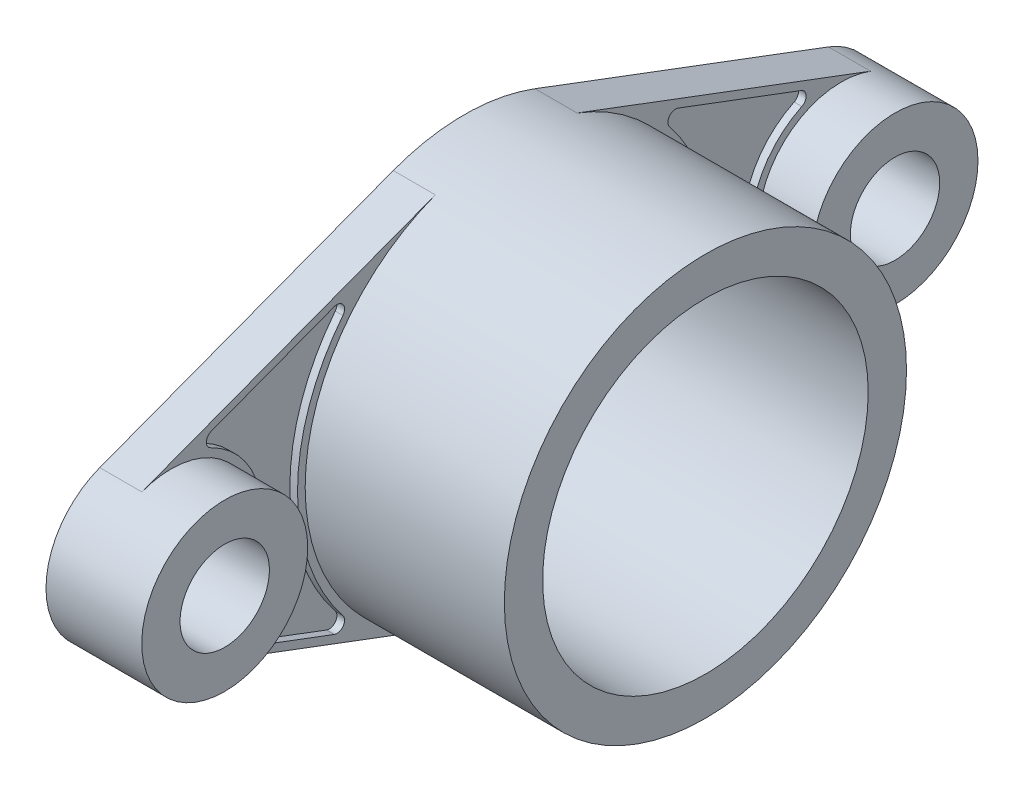
ISO-10303-21;
HEADER;
FILE_DESCRIPTION(('STEP AP214'),'2;1');
FILE_NAME('part.step','',(''),(''),'','','');
FILE_SCHEMA(('AUTOMOTIVE_DESIGN { 1 0 10303 214 1 1 1 1 }'));
ENDSEC;
DATA;
#1=APPLICATION_CONTEXT('core data for automotive mechanical design processes');
#2=APPLICATION_PROTOCOL_DEFINITION('international standard','automotive_design',2000,#1);
#3=PRODUCT_CONTEXT('',#1,'mechanical');
#4=PRODUCT('Part','Part','',(#3));
#5=PRODUCT_RELATED_PRODUCT_CATEGORY('part','',(#4));
#6=PRODUCT_DEFINITION_FORMATION('','',#4);
#7=PRODUCT_DEFINITION_CONTEXT('part definition',#1,'design');
#8=PRODUCT_DEFINITION('design','',#6,#7);
#9=PRODUCT_DEFINITION_SHAPE('','',#8);
#10=(LENGTH_UNIT() NAMED_UNIT(*) SI_UNIT(.MILLI.,.METRE.));
#11=(NAMED_UNIT(*) PLANE_ANGLE_UNIT() SI_UNIT($,.RADIAN.));
#12=(NAMED_UNIT(*) SI_UNIT($,.STERADIAN.) SOLID_ANGLE_UNIT());
#13=UNCERTAINTY_MEASURE_WITH_UNIT(LENGTH_MEASURE(1.E-05),#10,'distance_accuracy_value','');
#14=(GEOMETRIC_REPRESENTATION_CONTEXT(3) GLOBAL_UNCERTAINTY_ASSIGNED_CONTEXT((#13)) GLOBAL_UNIT_ASSIGNED_CONTEXT((#10,
#11,#12)) REPRESENTATION_CONTEXT('',''));
#15=CARTESIAN_POINT('',(0.,0.,0.));
#16=DIRECTION('',(0.,0.,1.));
#17=DIRECTION('',(1.,0.,0.));
#18=AXIS2_PLACEMENT_3D('',#15,#16,#17);
#19=CARTESIAN_POINT('',(11.,0.,87.5));
#20=DIRECTION('',(1.,0.,0.));
#21=DIRECTION('',(0.,0.,-1.));
#22=AXIS2_PLACEMENT_3D('',#19,#20,#21);
#23=PLANE('',#22);
#24=CARTESIAN_POINT('',(11.,0.,87.5));
#25=DIRECTION('',(-1.,0.,0.));
#26=DIRECTION('',(0.,0.,-1.));
#27=AXIS2_PLACEMENT_3D('',#24,#25,#26);
#28=CIRCLE('',#27,21.6666666666667);
#29=CARTESIAN_POINT('',(11.,20.2768940260314,95.1349206349206));
#30=VERTEX_POINT('',#29);
#31=CARTESIAN_POINT('',(11.,-20.2768940260314,95.1349206349206));
#32=VERTEX_POINT('',#31);
#33=EDGE_CURVE('E387',#30,#32,#28,.T.);
#34=ORIENTED_EDGE('',*,*,#33,.T.);
#35=DIRECTION('',(0.,-0.352380952380952,-0.935856647355295));
#36=VECTOR('',#35,1.);
#37=CARTESIAN_POINT('',(11.,-20.2768940260314,95.1349206349206));
#38=LINE('',#37,#36);
#39=CARTESIAN_POINT('',(11.,-49.132473986153,18.5));
#40=VERTEX_POINT('',#39);
#41=EDGE_CURVE('E390',#32,#40,#38,.T.);
#42=ORIENTED_EDGE('',*,*,#41,.T.);
#43=CARTESIAN_POINT('',(11.,0.,0.));
#44=DIRECTION('',(-1.,0.,0.));
#45=DIRECTION('',(0.,0.,-1.));
#46=AXIS2_PLACEMENT_3D('',#43,#44,#45);
#47=CIRCLE('',#46,52.5);
#48=CARTESIAN_POINT('',(11.,49.132473986153,18.5));
#49=VERTEX_POINT('',#48);
#50=EDGE_CURVE('E394',#40,#49,#47,.T.);
#51=ORIENTED_EDGE('',*,*,#50,.T.);
#52=DIRECTION('',(0.,-0.352380952380952,0.935856647355295));
#53=VECTOR('',#52,1.);
#54=CARTESIAN_POINT('',(11.,20.2768940260314,95.1349206349206));
#55=LINE('',#54,#53);
#56=EDGE_CURVE('E397',#49,#30,#55,.T.);
#57=ORIENTED_EDGE('',*,*,#56,.T.);
#58=EDGE_LOOP('',(#34,#42,#51,#57));
#59=FACE_BOUND('',#58,.T.);
#60=CARTESIAN_POINT('',(11.,23.0944437111429,76.300694331762));
#61=DIRECTION('',(1.,0.,0.));
#62=DIRECTION('',(0.,0.,1.));
#63=AXIS2_PLACEMENT_3D('',#60,#61,#62);
#64=CIRCLE('',#63,1.99999999999999);
#65=CARTESIAN_POINT('',(11.,24.9661570058535,77.0054562365239));
#66=VERTEX_POINT('',#65);
#67=CARTESIAN_POINT('',(11.,21.2948766687162,77.1733675007156));
#68=VERTEX_POINT('',#67);
#69=EDGE_CURVE('E56',#66,#68,#64,.T.);
#70=ORIENTED_EDGE('',*,*,#69,.F.);
#71=DIRECTION('',(0.,-0.352380952380952,0.935856647355295));
#72=VECTOR('',#71,1.);
#73=CARTESIAN_POINT('',(11.,37.0477904131755,44.9189406097408));
#74=LINE('',#73,#72);
#75=CARTESIAN_POINT('',(11.,37.0477904131755,44.9189406097408));
#76=VERTEX_POINT('',#75);
#77=EDGE_CURVE('E223',#76,#66,#74,.T.);
#78=ORIENTED_EDGE('',*,*,#77,.F.);
#79=CARTESIAN_POINT('',(11.,35.1760771184649,44.2141787049789));
#80=DIRECTION('',(1.,0.,0.));
#81=DIRECTION('',(0.,0.,-1.));
#82=AXIS2_PLACEMENT_3D('',#79,#80,#81);
#83=CIRCLE('',#82,2.00000000000001);
#84=CARTESIAN_POINT('',(11.,33.9309062470148,42.6490750340062));
#85=VERTEX_POINT('',#84);
#86=EDGE_CURVE('E226',#85,#76,#83,.T.);
#87=ORIENTED_EDGE('',*,*,#86,.F.);
#88=CARTESIAN_POINT('',(11.,0.,0.));
#89=DIRECTION('',(-1.,0.,0.));
#90=DIRECTION('',(0.,0.,-1.));
#91=AXIS2_PLACEMENT_3D('',#88,#89,#90);
#92=CIRCLE('',#91,54.5);
#93=CARTESIAN_POINT('',(11.,-33.9309062470148,42.6490750340062));
#94=VERTEX_POINT('',#93);
#95=EDGE_CURVE('E255',#94,#85,#92,.T.);
#96=ORIENTED_EDGE('',*,*,#95,.F.);
#97=CARTESIAN_POINT('',(11.,-35.1760771184649,44.2141787049789));
#98=DIRECTION('',(1.,0.,0.));
#99=DIRECTION('',(0.,0.,-1.));
#100=AXIS2_PLACEMENT_3D('',#97,#98,#99);
#101=CIRCLE('',#100,2.);
#102=CARTESIAN_POINT('',(11.,-37.0477904131755,44.9189406097408));
#103=VERTEX_POINT('',#102);
#104=EDGE_CURVE('E252',#103,#94,#101,.T.);
#105=ORIENTED_EDGE('',*,*,#104,.F.);
#106=DIRECTION('',(0.,-0.352380952380952,-0.935856647355295));
#107=VECTOR('',#106,1.);
#108=CARTESIAN_POINT('',(11.,-24.9661570058535,77.0054562365239));
#109=LINE('',#108,#107);
#110=CARTESIAN_POINT('',(11.,-24.9661570058535,77.0054562365239));
#111=VERTEX_POINT('',#110);
#112=EDGE_CURVE('E249',#111,#103,#109,.T.);
#113=ORIENTED_EDGE('',*,*,#112,.F.);
#114=CARTESIAN_POINT('',(11.,-23.0944437111429,76.300694331762));
#115=DIRECTION('',(1.,0.,0.));
#116=DIRECTION('',(0.,0.,-1.));
#117=AXIS2_PLACEMENT_3D('',#114,#115,#116);
#118=CIRCLE('',#117,1.99999999999999);
#119=CARTESIAN_POINT('',(11.,-21.2948766687162,77.1733675007156));
#120=VERTEX_POINT('',#119);
#121=EDGE_CURVE('E246',#120,#111,#118,.T.);
#122=ORIENTED_EDGE('',*,*,#121,.F.);
#123=CARTESIAN_POINT('',(11.,0.,87.5));
#124=DIRECTION('',(-1.,0.,0.));
#125=DIRECTION('',(0.,0.,-1.));
#126=AXIS2_PLACEMENT_3D('',#123,#124,#125);
#127=CIRCLE('',#126,23.6666666666667);
#128=EDGE_CURVE('E243',#68,#120,#127,.T.);
#129=ORIENTED_EDGE('',*,*,#128,.F.);
#130=EDGE_LOOP('',(#70,#78,#87,#96,#105,#113,#122,#129));
#131=FACE_BOUND('',#130,.T.);
#132=ADVANCED_FACE('F39',(#59,#131),#23,.T.);
#133=CARTESIAN_POINT('',(25.,0.,0.));
#134=DIRECTION('',(-1.,0.,0.));
#135=DIRECTION('',(0.,0.,1.));
#136=AXIS2_PLACEMENT_3D('',#133,#134,#135);
#137=CYLINDRICAL_SURFACE('',#136,52.5);
#138=CARTESIAN_POINT('',(63.,0.,0.));
#139=DIRECTION('',(1.,0.,0.));
#140=DIRECTION('',(0.,0.,-1.));
#141=AXIS2_PLACEMENT_3D('',#138,#139,#140);
#142=CIRCLE('',#141,52.5);
#143=CARTESIAN_POINT('',(63.,0.,-52.5));
#144=VERTEX_POINT('',#143);
#145=EDGE_CURVE('E377',#144,#144,#142,.T.);
#146=ORIENTED_EDGE('',*,*,#145,.F.);
#147=EDGE_LOOP('',(#146));
#148=FACE_BOUND('',#147,.T.);
#149=DIRECTION('',(-1.,0.,0.));
#150=VECTOR('',#149,1.);
#151=CARTESIAN_POINT('',(11.,-49.132473986153,-18.5));
#152=LINE('',#151,#150);
#153=CARTESIAN_POINT('',(11.,-49.132473986153,-18.5));
#154=VERTEX_POINT('',#153);
#155=CARTESIAN_POINT('',(0.,-49.132473986153,-18.5));
#156=VERTEX_POINT('',#155);
#157=EDGE_CURVE('E371',#154,#156,#152,.T.);
#158=ORIENTED_EDGE('',*,*,#157,.F.);
#159=CARTESIAN_POINT('',(11.,0.,0.));
#160=DIRECTION('',(-1.,0.,0.));
#161=DIRECTION('',(0.,0.,-1.));
#162=AXIS2_PLACEMENT_3D('',#159,#160,#161);
#163=CIRCLE('',#162,52.5);
#164=CARTESIAN_POINT('',(11.,49.132473986153,-18.5));
#165=VERTEX_POINT('',#164);
#166=EDGE_CURVE('E346',#165,#154,#163,.T.);
#167=ORIENTED_EDGE('',*,*,#166,.F.);
#168=DIRECTION('',(-1.,0.,0.));
#169=VECTOR('',#168,1.);
#170=CARTESIAN_POINT('',(11.,49.132473986153,-18.5));
#171=LINE('',#170,#169);
#172=CARTESIAN_POINT('',(0.,49.132473986153,-18.5));
#173=VERTEX_POINT('',#172);
#174=EDGE_CURVE('E359',#165,#173,#171,.T.);
#175=ORIENTED_EDGE('',*,*,#174,.T.);
#176=CARTESIAN_POINT('',(0.,0.,0.));
#177=DIRECTION('',(1.,0.,0.));
#178=DIRECTION('',(0.,0.,-1.));
#179=AXIS2_PLACEMENT_3D('',#176,#177,#178);
#180=CIRCLE('',#179,52.5);
#181=CARTESIAN_POINT('',(0.,49.132473986153,18.5));
#182=VERTEX_POINT('',#181);
#183=EDGE_CURVE('E380',#173,#182,#180,.T.);
#184=ORIENTED_EDGE('',*,*,#183,.T.);
#185=DIRECTION('',(-1.,0.,0.));
#186=VECTOR('',#185,1.);
#187=CARTESIAN_POINT('',(11.,49.132473986153,18.5));
#188=LINE('',#187,#186);
#189=EDGE_CURVE('E407',#49,#182,#188,.T.);
#190=ORIENTED_EDGE('',*,*,#189,.F.);
#191=ORIENTED_EDGE('',*,*,#50,.F.);
#192=DIRECTION('',(-1.,0.,0.));
#193=VECTOR('',#192,1.);
#194=CARTESIAN_POINT('',(11.,-49.132473986153,18.5));
#195=LINE('',#194,#193);
#196=CARTESIAN_POINT('',(0.,-49.132473986153,18.5));
#197=VERTEX_POINT('',#196);
#198=EDGE_CURVE('E410',#40,#197,#195,.T.);
#199=ORIENTED_EDGE('',*,*,#198,.T.);
#200=EDGE_CURVE('E381',#197,#156,#180,.T.);
#201=ORIENTED_EDGE('',*,*,#200,.T.);
#202=EDGE_LOOP('',(#158,#167,#175,#184,#190,#191,#199,#201));
#203=FACE_BOUND('',#202,.T.);
#204=ADVANCED_FACE('F435',(#148,#203),#137,.T.);
#205=CARTESIAN_POINT('',(25.,0.,87.5));
#206=DIRECTION('',(-1.,0.,0.));
#207=DIRECTION('',(0.,0.,1.));
#208=AXIS2_PLACEMENT_3D('',#205,#206,#207);
#209=CYLINDRICAL_SURFACE('',#208,21.6666666666667);
#210=CARTESIAN_POINT('',(25.,0.,87.5));
#211=DIRECTION('',(1.,0.,0.));
#212=DIRECTION('',(0.,0.,-1.));
#213=AXIS2_PLACEMENT_3D('',#210,#211,#212);
#214=CIRCLE('',#213,21.6666666666667);
#215=CARTESIAN_POINT('',(25.,0.,65.8333333333333));
#216=VERTEX_POINT('',#215);
#217=EDGE_CURVE('E48',#216,#216,#214,.T.);
#218=ORIENTED_EDGE('',*,*,#217,.F.);
#219=EDGE_LOOP('',(#218));
#220=FACE_BOUND('',#219,.T.);
#221=DIRECTION('',(-1.,0.,0.));
#222=VECTOR('',#221,1.);
#223=CARTESIAN_POINT('',(11.,-20.2768940260314,95.1349206349206));
#224=LINE('',#223,#222);
#225=CARTESIAN_POINT('',(0.,-20.2768940260314,95.1349206349206));
#226=VERTEX_POINT('',#225);
#227=EDGE_CURVE('E412',#32,#226,#224,.T.);
#228=ORIENTED_EDGE('',*,*,#227,.F.);
#229=ORIENTED_EDGE('',*,*,#33,.F.);
#230=DIRECTION('',(-1.,0.,0.));
#231=VECTOR('',#230,1.);
#232=CARTESIAN_POINT('',(11.,20.2768940260314,95.1349206349206));
#233=LINE('',#232,#231);
#234=CARTESIAN_POINT('',(0.,20.2768940260314,95.1349206349206));
#235=VERTEX_POINT('',#234);
#236=EDGE_CURVE('E400',#30,#235,#233,.T.);
#237=ORIENTED_EDGE('',*,*,#236,.T.);
#238=CARTESIAN_POINT('',(0.,0.,87.5));
#239=DIRECTION('',(1.,0.,0.));
#240=DIRECTION('',(0.,0.,-1.));
#241=AXIS2_PLACEMENT_3D('',#238,#239,#240);
#242=CIRCLE('',#241,21.6666666666667);
#243=EDGE_CURVE('E415',#235,#226,#242,.T.);
#244=ORIENTED_EDGE('',*,*,#243,.T.);
#245=EDGE_LOOP('',(#228,#229,#237,#244));
#246=FACE_BOUND('',#245,.T.);
#247=ADVANCED_FACE('F41',(#220,#246),#209,.T.);
#248=CARTESIAN_POINT('',(25.,0.,87.5));
#249=DIRECTION('',(-1.,0.,0.));
#250=DIRECTION('',(0.,0.,1.));
#251=AXIS2_PLACEMENT_3D('',#248,#249,#250);
#252=CYLINDRICAL_SURFACE('',#251,11.6666666666667);
#253=CARTESIAN_POINT('',(25.,0.,87.5));
#254=DIRECTION('',(1.,0.,0.));
#255=DIRECTION('',(0.,0.,-1.));
#256=AXIS2_PLACEMENT_3D('',#253,#254,#255);
#257=CIRCLE('',#256,11.6666666666667);
#258=CARTESIAN_POINT('',(25.,0.,75.8333333333333));
#259=VERTEX_POINT('',#258);
#260=EDGE_CURVE('E11',#259,#259,#257,.T.);
#261=ORIENTED_EDGE('',*,*,#260,.T.);
#262=EDGE_LOOP('',(#261));
#263=FACE_BOUND('',#262,.T.);
#264=CARTESIAN_POINT('',(0.,0.,87.5));
#265=DIRECTION('',(1.,0.,0.));
#266=DIRECTION('',(0.,0.,-1.));
#267=AXIS2_PLACEMENT_3D('',#264,#265,#266);
#268=CIRCLE('',#267,11.6666666666667);
#269=CARTESIAN_POINT('',(0.,0.,75.8333333333333));
#270=VERTEX_POINT('',#269);
#271=EDGE_CURVE('E43',#270,#270,#268,.T.);
#272=ORIENTED_EDGE('',*,*,#271,.F.);
#273=EDGE_LOOP('',(#272));
#274=FACE_BOUND('',#273,.T.);
#275=ADVANCED_FACE('F425',(#263,#274),#252,.F.);
#276=CARTESIAN_POINT('',(25.,0.,0.));
#277=DIRECTION('',(1.,0.,0.));
#278=DIRECTION('',(0.,0.,-1.));
#279=AXIS2_PLACEMENT_3D('',#276,#277,#278);
#280=PLANE('',#279);
#281=ORIENTED_EDGE('',*,*,#217,.T.);
#282=EDGE_LOOP('',(#281));
#283=FACE_BOUND('',#282,.T.);
#284=ORIENTED_EDGE('',*,*,#260,.F.);
#285=EDGE_LOOP('',(#284));
#286=FACE_BOUND('',#285,.T.);
#287=ADVANCED_FACE('F427',(#283,#286),#280,.T.);
#288=CARTESIAN_POINT('',(0.,0.,0.));
#289=DIRECTION('',(1.,0.,0.));
#290=DIRECTION('',(0.,0.,-1.));
#291=AXIS2_PLACEMENT_3D('',#288,#289,#290);
#292=PLANE('',#291);
#293=ORIENTED_EDGE('',*,*,#243,.F.);
#294=DIRECTION('',(0.,-0.352380952380952,0.935856647355295));
#295=VECTOR('',#294,1.);
#296=CARTESIAN_POINT('',(0.,20.2768940260314,95.1349206349206));
#297=LINE('',#296,#295);
#298=EDGE_CURVE('E391',#182,#235,#297,.T.);
#299=ORIENTED_EDGE('',*,*,#298,.F.);
#300=ORIENTED_EDGE('',*,*,#183,.F.);
#301=DIRECTION('',(0.,0.352380952380952,0.935856647355295));
#302=VECTOR('',#301,1.);
#303=CARTESIAN_POINT('',(0.,49.132473986153,-18.5));
#304=LINE('',#303,#302);
#305=CARTESIAN_POINT('',(0.,20.2768940260314,-95.1349206349206));
#306=VERTEX_POINT('',#305);
#307=EDGE_CURVE('E350',#306,#173,#304,.T.);
#308=ORIENTED_EDGE('',*,*,#307,.F.);
#309=CARTESIAN_POINT('',(0.,0.,-87.5));
#310=DIRECTION('',(1.,0.,0.));
#311=DIRECTION('',(0.,0.,-1.));
#312=AXIS2_PLACEMENT_3D('',#309,#310,#311);
#313=CIRCLE('',#312,21.6666666666667);
#314=CARTESIAN_POINT('',(0.,-20.2768940260314,-95.1349206349206));
#315=VERTEX_POINT('',#314);
#316=EDGE_CURVE('E339',#315,#306,#313,.T.);
#317=ORIENTED_EDGE('',*,*,#316,.F.);
#318=DIRECTION('',(0.,0.352380952380953,-0.935856647355295));
#319=VECTOR('',#318,1.);
#320=CARTESIAN_POINT('',(0.,-20.2768940260314,-95.1349206349206));
#321=LINE('',#320,#319);
#322=EDGE_CURVE('E342',#156,#315,#321,.T.);
#323=ORIENTED_EDGE('',*,*,#322,.F.);
#324=ORIENTED_EDGE('',*,*,#200,.F.);
#325=DIRECTION('',(0.,-0.352380952380952,-0.935856647355295));
#326=VECTOR('',#325,1.);
#327=CARTESIAN_POINT('',(0.,-20.2768940260314,95.1349206349206));
#328=LINE('',#327,#326);
#329=EDGE_CURVE('E386',#226,#197,#328,.T.);
#330=ORIENTED_EDGE('',*,*,#329,.F.);
#331=EDGE_LOOP('',(#293,#299,#300,#308,#317,#323,#324,#330));
#332=FACE_BOUND('',#331,.T.);
#333=ORIENTED_EDGE('',*,*,#271,.T.);
#334=EDGE_LOOP('',(#333));
#335=FACE_BOUND('',#334,.T.);
#336=CARTESIAN_POINT('',(0.,0.,0.));
#337=DIRECTION('',(1.,0.,0.));
#338=DIRECTION('',(0.,0.,-1.));
#339=AXIS2_PLACEMENT_3D('',#336,#337,#338);
#340=CIRCLE('',#339,42.5);
#341=CARTESIAN_POINT('',(0.,0.,-42.5));
#342=VERTEX_POINT('',#341);
#343=EDGE_CURVE('E383',#342,#342,#340,.T.);
#344=ORIENTED_EDGE('',*,*,#343,.T.);
#345=EDGE_LOOP('',(#344));
#346=FACE_BOUND('',#345,.T.);
#347=CARTESIAN_POINT('',(0.,0.,-87.5));
#348=DIRECTION('',(1.,0.,0.));
#349=DIRECTION('',(0.,0.,-1.));
#350=AXIS2_PLACEMENT_3D('',#347,#348,#349);
#351=CIRCLE('',#350,11.6666666666667);
#352=CARTESIAN_POINT('',(0.,0.,-99.1666666666667));
#353=VERTEX_POINT('',#352);
#354=EDGE_CURVE('E262',#353,#353,#351,.T.);
#355=ORIENTED_EDGE('',*,*,#354,.T.);
#356=EDGE_LOOP('',(#355));
#357=FACE_BOUND('',#356,.T.);
#358=ADVANCED_FACE('F422',(#332,#335,#346,#357),#292,.F.);
#359=CARTESIAN_POINT('',(11.,-20.2768940260314,95.1349206349206));
#360=DIRECTION('',(0.,0.935856647355295,-0.352380952380952));
#361=DIRECTION('',(0.,0.352380952380952,0.935856647355295));
#362=AXIS2_PLACEMENT_3D('',#359,#360,#361);
#363=PLANE('',#362);
#364=ORIENTED_EDGE('',*,*,#329,.T.);
#365=ORIENTED_EDGE('',*,*,#198,.F.);
#366=ORIENTED_EDGE('',*,*,#41,.F.);
#367=ORIENTED_EDGE('',*,*,#227,.T.);
#368=EDGE_LOOP('',(#364,#365,#366,#367));
#369=FACE_BOUND('',#368,.T.);
#370=ADVANCED_FACE('F453',(#369),#363,.F.);
#371=CARTESIAN_POINT('',(11.,20.2768940260314,95.1349206349206));
#372=DIRECTION('',(0.,-0.935856647355295,-0.352380952380952));
#373=DIRECTION('',(0.,0.352380952380952,-0.935856647355295));
#374=AXIS2_PLACEMENT_3D('',#371,#372,#373);
#375=PLANE('',#374);
#376=ORIENTED_EDGE('',*,*,#298,.T.);
#377=ORIENTED_EDGE('',*,*,#236,.F.);
#378=ORIENTED_EDGE('',*,*,#56,.F.);
#379=ORIENTED_EDGE('',*,*,#189,.T.);
#380=EDGE_LOOP('',(#376,#377,#378,#379));
#381=FACE_BOUND('',#380,.T.);
#382=ADVANCED_FACE('F449',(#381),#375,.F.);
#383=CARTESIAN_POINT('',(25.,0.,0.));
#384=DIRECTION('',(-1.,0.,0.));
#385=DIRECTION('',(0.,0.,1.));
#386=AXIS2_PLACEMENT_3D('',#383,#384,#385);
#387=CYLINDRICAL_SURFACE('',#386,42.5);
#388=ORIENTED_EDGE('',*,*,#343,.F.);
#389=EDGE_LOOP('',(#388));
#390=FACE_BOUND('',#389,.T.);
#391=CARTESIAN_POINT('',(63.,0.,0.));
#392=DIRECTION('',(1.,0.,0.));
#393=DIRECTION('',(0.,0.,-1.));
#394=AXIS2_PLACEMENT_3D('',#391,#392,#393);
#395=CIRCLE('',#394,42.5);
#396=CARTESIAN_POINT('',(63.,0.,-42.5));
#397=VERTEX_POINT('',#396);
#398=EDGE_CURVE('E374',#397,#397,#395,.T.);
#399=ORIENTED_EDGE('',*,*,#398,.T.);
#400=EDGE_LOOP('',(#399));
#401=FACE_BOUND('',#400,.T.);
#402=ADVANCED_FACE('F452',(#390,#401),#387,.F.);
#403=CARTESIAN_POINT('',(63.,0.,0.));
#404=DIRECTION('',(1.,0.,0.));
#405=DIRECTION('',(0.,0.,-1.));
#406=AXIS2_PLACEMENT_3D('',#403,#404,#405);
#407=PLANE('',#406);
#408=ORIENTED_EDGE('',*,*,#145,.T.);
#409=EDGE_LOOP('',(#408));
#410=FACE_BOUND('',#409,.T.);
#411=ORIENTED_EDGE('',*,*,#398,.F.);
#412=EDGE_LOOP('',(#411));
#413=FACE_BOUND('',#412,.T.);
#414=ADVANCED_FACE('F512',(#410,#413),#407,.T.);
#415=CARTESIAN_POINT('',(11.,-20.2768940260314,-95.1349206349206));
#416=DIRECTION('',(0.,0.935856647355295,0.352380952380953));
#417=DIRECTION('',(0.,-0.352380952380953,0.935856647355295));
#418=AXIS2_PLACEMENT_3D('',#415,#416,#417);
#419=PLANE('',#418);
#420=ORIENTED_EDGE('',*,*,#322,.T.);
#421=DIRECTION('',(-1.,0.,0.));
#422=VECTOR('',#421,1.);
#423=CARTESIAN_POINT('',(11.,-20.2768940260314,-95.1349206349206));
#424=LINE('',#423,#422);
#425=CARTESIAN_POINT('',(11.,-20.2768940260314,-95.1349206349206));
#426=VERTEX_POINT('',#425);
#427=EDGE_CURVE('E369',#426,#315,#424,.T.);
#428=ORIENTED_EDGE('',*,*,#427,.F.);
#429=DIRECTION('',(0.,0.352380952380953,-0.935856647355295));
#430=VECTOR('',#429,1.);
#431=CARTESIAN_POINT('',(11.,-20.2768940260314,-95.1349206349206));
#432=LINE('',#431,#430);
#433=EDGE_CURVE('E349',#154,#426,#432,.T.);
#434=ORIENTED_EDGE('',*,*,#433,.F.);
#435=ORIENTED_EDGE('',*,*,#157,.T.);
#436=EDGE_LOOP('',(#420,#428,#434,#435));
#437=FACE_BOUND('',#436,.T.);
#438=ADVANCED_FACE('F474',(#437),#419,.F.);
#439=CARTESIAN_POINT('',(11.,49.132473986153,-18.5));
#440=DIRECTION('',(0.,-0.935856647355295,0.352380952380952));
#441=DIRECTION('',(0.,-0.352380952380952,-0.935856647355295));
#442=AXIS2_PLACEMENT_3D('',#439,#440,#441);
#443=PLANE('',#442);
#444=ORIENTED_EDGE('',*,*,#307,.T.);
#445=ORIENTED_EDGE('',*,*,#174,.F.);
#446=DIRECTION('',(0.,0.352380952380952,0.935856647355295));
#447=VECTOR('',#446,1.);
#448=CARTESIAN_POINT('',(11.,49.132473986153,-18.5));
#449=LINE('',#448,#447);
#450=CARTESIAN_POINT('',(11.,20.2768940260314,-95.1349206349206));
#451=VERTEX_POINT('',#450);
#452=EDGE_CURVE('E356',#451,#165,#449,.T.);
#453=ORIENTED_EDGE('',*,*,#452,.F.);
#454=DIRECTION('',(-1.,0.,0.));
#455=VECTOR('',#454,1.);
#456=CARTESIAN_POINT('',(11.,20.2768940260314,-95.1349206349206));
#457=LINE('',#456,#455);
#458=EDGE_CURVE('E366',#451,#306,#457,.T.);
#459=ORIENTED_EDGE('',*,*,#458,.T.);
#460=EDGE_LOOP('',(#444,#445,#453,#459));
#461=FACE_BOUND('',#460,.T.);
#462=ADVANCED_FACE('F480',(#461),#443,.F.);
#463=CARTESIAN_POINT('',(11.,0.,0.));
#464=DIRECTION('',(1.,0.,0.));
#465=DIRECTION('',(0.,0.,-1.));
#466=AXIS2_PLACEMENT_3D('',#463,#464,#465);
#467=PLANE('',#466);
#468=CARTESIAN_POINT('',(11.,-35.176077118465,-44.2141787049789));
#469=DIRECTION('',(1.,0.,0.));
#470=DIRECTION('',(0.,0.,1.));
#471=AXIS2_PLACEMENT_3D('',#468,#469,#470);
#472=CIRCLE('',#471,2.);
#473=CARTESIAN_POINT('',(11.,-33.9309062470149,-42.6490750340061));
#474=VERTEX_POINT('',#473);
#475=CARTESIAN_POINT('',(11.,-37.0477904131755,-44.9189406097408));
#476=VERTEX_POINT('',#475);
#477=EDGE_CURVE('E64',#474,#476,#472,.T.);
#478=ORIENTED_EDGE('',*,*,#477,.F.);
#479=CARTESIAN_POINT('',(11.,0.,0.));
#480=DIRECTION('',(-1.,0.,0.));
#481=DIRECTION('',(0.,0.,-1.));
#482=AXIS2_PLACEMENT_3D('',#479,#480,#481);
#483=CIRCLE('',#482,54.5);
#484=CARTESIAN_POINT('',(11.,33.9309062470149,-42.6490750340062));
#485=VERTEX_POINT('',#484);
#486=EDGE_CURVE('E278',#485,#474,#483,.T.);
#487=ORIENTED_EDGE('',*,*,#486,.F.);
#488=CARTESIAN_POINT('',(11.,35.1760771184649,-44.2141787049789));
#489=DIRECTION('',(1.,0.,0.));
#490=DIRECTION('',(0.,0.,-1.));
#491=AXIS2_PLACEMENT_3D('',#488,#489,#490);
#492=CIRCLE('',#491,2.00000000000001);
#493=CARTESIAN_POINT('',(11.,37.0477904131756,-44.9189406097408));
#494=VERTEX_POINT('',#493);
#495=EDGE_CURVE('E316',#494,#485,#492,.T.);
#496=ORIENTED_EDGE('',*,*,#495,.F.);
#497=DIRECTION('',(0.,0.352380952380952,0.935856647355295));
#498=VECTOR('',#497,1.);
#499=CARTESIAN_POINT('',(11.,24.9661570058535,-77.0054562365239));
#500=LINE('',#499,#498);
#501=CARTESIAN_POINT('',(11.,24.9661570058535,-77.0054562365239));
#502=VERTEX_POINT('',#501);
#503=EDGE_CURVE('E313',#502,#494,#500,.T.);
#504=ORIENTED_EDGE('',*,*,#503,.F.);
#505=CARTESIAN_POINT('',(11.,23.094443711143,-76.300694331762));
#506=DIRECTION('',(1.,0.,0.));
#507=DIRECTION('',(0.,0.,-1.));
#508=AXIS2_PLACEMENT_3D('',#505,#506,#507);
#509=CIRCLE('',#508,2.);
#510=CARTESIAN_POINT('',(11.,21.2948766687162,-77.1733675007156));
#511=VERTEX_POINT('',#510);
#512=EDGE_CURVE('E310',#511,#502,#509,.T.);
#513=ORIENTED_EDGE('',*,*,#512,.F.);
#514=CARTESIAN_POINT('',(11.,0.,-87.5));
#515=DIRECTION('',(-1.,0.,0.));
#516=DIRECTION('',(0.,0.,-1.));
#517=AXIS2_PLACEMENT_3D('',#514,#515,#516);
#518=CIRCLE('',#517,23.6666666666667);
#519=CARTESIAN_POINT('',(11.,-21.2948766687162,-77.1733675007156));
#520=VERTEX_POINT('',#519);
#521=EDGE_CURVE('E307',#520,#511,#518,.T.);
#522=ORIENTED_EDGE('',*,*,#521,.F.);
#523=CARTESIAN_POINT('',(11.,-23.0944437111429,-76.3006943317619));
#524=DIRECTION('',(1.,0.,0.));
#525=DIRECTION('',(0.,0.,-1.));
#526=AXIS2_PLACEMENT_3D('',#523,#524,#525);
#527=CIRCLE('',#526,2.);
#528=CARTESIAN_POINT('',(11.,-24.9661570058535,-77.0054562365238));
#529=VERTEX_POINT('',#528);
#530=EDGE_CURVE('E304',#529,#520,#527,.T.);
#531=ORIENTED_EDGE('',*,*,#530,.F.);
#532=DIRECTION('',(0.,0.352380952380953,-0.935856647355295));
#533=VECTOR('',#532,1.);
#534=CARTESIAN_POINT('',(11.,-37.0477904131755,-44.9189406097408));
#535=LINE('',#534,#533);
#536=EDGE_CURVE('E301',#476,#529,#535,.T.);
#537=ORIENTED_EDGE('',*,*,#536,.F.);
#538=EDGE_LOOP('',(#478,#487,#496,#504,#513,#522,#531,#537));
#539=FACE_BOUND('',#538,.T.);
#540=ORIENTED_EDGE('',*,*,#166,.T.);
#541=ORIENTED_EDGE('',*,*,#433,.T.);
#542=CARTESIAN_POINT('',(11.,0.,-87.5));
#543=DIRECTION('',(-1.,0.,0.));
#544=DIRECTION('',(0.,0.,-1.));
#545=AXIS2_PLACEMENT_3D('',#542,#543,#544);
#546=CIRCLE('',#545,21.6666666666667);
#547=EDGE_CURVE('E353',#426,#451,#546,.T.);
#548=ORIENTED_EDGE('',*,*,#547,.T.);
#549=ORIENTED_EDGE('',*,*,#452,.T.);
#550=EDGE_LOOP('',(#540,#541,#548,#549));
#551=FACE_BOUND('',#550,.T.);
#552=ADVANCED_FACE('F478',(#539,#551),#467,.T.);
#553=CARTESIAN_POINT('',(25.,0.,-87.5));
#554=DIRECTION('',(-1.,0.,0.));
#555=DIRECTION('',(0.,0.,1.));
#556=AXIS2_PLACEMENT_3D('',#553,#554,#555);
#557=CYLINDRICAL_SURFACE('',#556,11.6666666666667);
#558=CARTESIAN_POINT('',(25.,0.,-87.5));
#559=DIRECTION('',(1.,0.,0.));
#560=DIRECTION('',(0.,0.,-1.));
#561=AXIS2_PLACEMENT_3D('',#558,#559,#560);
#562=CIRCLE('',#561,11.6666666666667);
#563=CARTESIAN_POINT('',(25.,0.,-99.1666666666667));
#564=VERTEX_POINT('',#563);
#565=EDGE_CURVE('E335',#564,#564,#562,.T.);
#566=ORIENTED_EDGE('',*,*,#565,.T.);
#567=EDGE_LOOP('',(#566));
#568=FACE_BOUND('',#567,.T.);
#569=ORIENTED_EDGE('',*,*,#354,.F.);
#570=EDGE_LOOP('',(#569));
#571=FACE_BOUND('',#570,.T.);
#572=ADVANCED_FACE('F486',(#568,#571),#557,.F.);
#573=CARTESIAN_POINT('',(25.,0.,-87.5));
#574=DIRECTION('',(-1.,0.,0.));
#575=DIRECTION('',(0.,0.,1.));
#576=AXIS2_PLACEMENT_3D('',#573,#574,#575);
#577=CYLINDRICAL_SURFACE('',#576,21.6666666666667);
#578=ORIENTED_EDGE('',*,*,#427,.T.);
#579=ORIENTED_EDGE('',*,*,#316,.T.);
#580=ORIENTED_EDGE('',*,*,#458,.F.);
#581=ORIENTED_EDGE('',*,*,#547,.F.);
#582=EDGE_LOOP('',(#578,#579,#580,#581));
#583=FACE_BOUND('',#582,.T.);
#584=CARTESIAN_POINT('',(25.,0.,-87.5));
#585=DIRECTION('',(1.,0.,0.));
#586=DIRECTION('',(0.,0.,-1.));
#587=AXIS2_PLACEMENT_3D('',#584,#585,#586);
#588=CIRCLE('',#587,21.6666666666667);
#589=CARTESIAN_POINT('',(25.,0.,-109.166666666667));
#590=VERTEX_POINT('',#589);
#591=EDGE_CURVE('E338',#590,#590,#588,.T.);
#592=ORIENTED_EDGE('',*,*,#591,.F.);
#593=EDGE_LOOP('',(#592));
#594=FACE_BOUND('',#593,.T.);
#595=ADVANCED_FACE('F482',(#583,#594),#577,.T.);
#596=CARTESIAN_POINT('',(25.,0.,0.));
#597=DIRECTION('',(1.,0.,0.));
#598=DIRECTION('',(0.,0.,-1.));
#599=AXIS2_PLACEMENT_3D('',#596,#597,#598);
#600=PLANE('',#599);
#601=ORIENTED_EDGE('',*,*,#565,.F.);
#602=EDGE_LOOP('',(#601));
#603=FACE_BOUND('',#602,.T.);
#604=ORIENTED_EDGE('',*,*,#591,.T.);
#605=EDGE_LOOP('',(#604));
#606=FACE_BOUND('',#605,.T.);
#607=ADVANCED_FACE('F485',(#603,#606),#600,.T.);
#608=CARTESIAN_POINT('',(9.,-35.176077118465,-44.2141787049789));
#609=DIRECTION('',(1.,0.,0.));
#610=DIRECTION('',(0.,0.,-1.));
#611=AXIS2_PLACEMENT_3D('',#608,#609,#610);
#612=CYLINDRICAL_SURFACE('',#611,2.);
#613=ORIENTED_EDGE('',*,*,#477,.T.);
#614=DIRECTION('',(1.,0.,0.));
#615=VECTOR('',#614,1.);
#616=CARTESIAN_POINT('',(9.,-37.0477904131755,-44.9189406097408));
#617=LINE('',#616,#615);
#618=CARTESIAN_POINT('',(9.,-37.0477904131755,-44.9189406097408));
#619=VERTEX_POINT('',#618);
#620=EDGE_CURVE('E299',#619,#476,#617,.T.);
#621=ORIENTED_EDGE('',*,*,#620,.F.);
#622=CARTESIAN_POINT('',(9.,-35.176077118465,-44.2141787049789));
#623=DIRECTION('',(1.,0.,0.));
#624=DIRECTION('',(0.,0.,1.));
#625=AXIS2_PLACEMENT_3D('',#622,#623,#624);
#626=CIRCLE('',#625,2.);
#627=CARTESIAN_POINT('',(9.,-33.9309062470149,-42.6490750340061));
#628=VERTEX_POINT('',#627);
#629=EDGE_CURVE('E274',#628,#619,#626,.T.);
#630=ORIENTED_EDGE('',*,*,#629,.F.);
#631=DIRECTION('',(1.,0.,0.));
#632=VECTOR('',#631,1.);
#633=CARTESIAN_POINT('',(9.,-33.9309062470149,-42.6490750340061));
#634=LINE('',#633,#632);
#635=EDGE_CURVE('E244',#628,#474,#634,.T.);
#636=ORIENTED_EDGE('',*,*,#635,.T.);
#637=EDGE_LOOP('',(#613,#621,#630,#636));
#638=FACE_BOUND('',#637,.T.);
#639=ADVANCED_FACE('F491',(#638),#612,.F.);
#640=CARTESIAN_POINT('',(9.,0.,0.));
#641=DIRECTION('',(1.,0.,0.));
#642=DIRECTION('',(0.,0.,-1.));
#643=AXIS2_PLACEMENT_3D('',#640,#641,#642);
#644=CYLINDRICAL_SURFACE('',#643,54.5);
#645=ORIENTED_EDGE('',*,*,#486,.T.);
#646=ORIENTED_EDGE('',*,*,#635,.F.);
#647=CARTESIAN_POINT('',(9.,0.,0.));
#648=DIRECTION('',(-1.,0.,0.));
#649=DIRECTION('',(0.,0.,-1.));
#650=AXIS2_PLACEMENT_3D('',#647,#648,#649);
#651=CIRCLE('',#650,54.5);
#652=CARTESIAN_POINT('',(9.,33.9309062470149,-42.6490750340062));
#653=VERTEX_POINT('',#652);
#654=EDGE_CURVE('E296',#653,#628,#651,.T.);
#655=ORIENTED_EDGE('',*,*,#654,.F.);
#656=DIRECTION('',(1.,0.,0.));
#657=VECTOR('',#656,1.);
#658=CARTESIAN_POINT('',(9.,33.9309062470149,-42.6490750340062));
#659=LINE('',#658,#657);
#660=EDGE_CURVE('E322',#653,#485,#659,.T.);
#661=ORIENTED_EDGE('',*,*,#660,.T.);
#662=EDGE_LOOP('',(#645,#646,#655,#661));
#663=FACE_BOUND('',#662,.T.);
#664=ADVANCED_FACE('F497',(#663),#644,.T.);
#665=CARTESIAN_POINT('',(9.,35.1760771184649,-44.2141787049789));
#666=DIRECTION('',(1.,0.,0.));
#667=DIRECTION('',(0.,0.,-1.));
#668=AXIS2_PLACEMENT_3D('',#665,#666,#667);
#669=CYLINDRICAL_SURFACE('',#668,2.00000000000001);
#670=ORIENTED_EDGE('',*,*,#495,.T.);
#671=ORIENTED_EDGE('',*,*,#660,.F.);
#672=CARTESIAN_POINT('',(9.,35.1760771184649,-44.2141787049789));
#673=DIRECTION('',(1.,0.,0.));
#674=DIRECTION('',(0.,0.,-1.));
#675=AXIS2_PLACEMENT_3D('',#672,#673,#674);
#676=CIRCLE('',#675,2.00000000000001);
#677=CARTESIAN_POINT('',(9.,37.0477904131756,-44.9189406097408));
#678=VERTEX_POINT('',#677);
#679=EDGE_CURVE('E293',#678,#653,#676,.T.);
#680=ORIENTED_EDGE('',*,*,#679,.F.);
#681=DIRECTION('',(1.,0.,0.));
#682=VECTOR('',#681,1.);
#683=CARTESIAN_POINT('',(9.,37.0477904131756,-44.9189406097408));
#684=LINE('',#683,#682);
#685=EDGE_CURVE('E324',#678,#494,#684,.T.);
#686=ORIENTED_EDGE('',*,*,#685,.T.);
#687=EDGE_LOOP('',(#670,#671,#680,#686));
#688=FACE_BOUND('',#687,.T.);
#689=ADVANCED_FACE('F578',(#688),#669,.F.);
#690=CARTESIAN_POINT('',(9.,24.9661570058535,-77.0054562365239));
#691=DIRECTION('',(0.,0.935856647355295,-0.352380952380952));
#692=DIRECTION('',(0.,0.352380952380952,0.935856647355295));
#693=AXIS2_PLACEMENT_3D('',#690,#691,#692);
#694=PLANE('',#693);
#695=ORIENTED_EDGE('',*,*,#503,.T.);
#696=ORIENTED_EDGE('',*,*,#685,.F.);
#697=DIRECTION('',(0.,0.352380952380952,0.935856647355295));
#698=VECTOR('',#697,1.);
#699=CARTESIAN_POINT('',(9.,24.9661570058535,-77.0054562365239));
#700=LINE('',#699,#698);
#701=CARTESIAN_POINT('',(9.,24.9661570058535,-77.0054562365239));
#702=VERTEX_POINT('',#701);
#703=EDGE_CURVE('E290',#702,#678,#700,.T.);
#704=ORIENTED_EDGE('',*,*,#703,.F.);
#705=DIRECTION('',(1.,0.,0.));
#706=VECTOR('',#705,1.);
#707=CARTESIAN_POINT('',(9.,24.9661570058535,-77.0054562365239));
#708=LINE('',#707,#706);
#709=EDGE_CURVE('E326',#702,#502,#708,.T.);
#710=ORIENTED_EDGE('',*,*,#709,.T.);
#711=EDGE_LOOP('',(#695,#696,#704,#710));
#712=FACE_BOUND('',#711,.T.);
#713=ADVANCED_FACE('F587',(#712),#694,.F.);
#714=CARTESIAN_POINT('',(9.,23.094443711143,-76.300694331762));
#715=DIRECTION('',(1.,0.,0.));
#716=DIRECTION('',(0.,0.,-1.));
#717=AXIS2_PLACEMENT_3D('',#714,#715,#716);
#718=CYLINDRICAL_SURFACE('',#717,2.);
#719=ORIENTED_EDGE('',*,*,#512,.T.);
#720=ORIENTED_EDGE('',*,*,#709,.F.);
#721=CARTESIAN_POINT('',(9.,23.094443711143,-76.300694331762));
#722=DIRECTION('',(1.,0.,0.));
#723=DIRECTION('',(0.,0.,-1.));
#724=AXIS2_PLACEMENT_3D('',#721,#722,#723);
#725=CIRCLE('',#724,2.);
#726=CARTESIAN_POINT('',(9.,21.2948766687162,-77.1733675007156));
#727=VERTEX_POINT('',#726);
#728=EDGE_CURVE('E287',#727,#702,#725,.T.);
#729=ORIENTED_EDGE('',*,*,#728,.F.);
#730=DIRECTION('',(1.,0.,0.));
#731=VECTOR('',#730,1.);
#732=CARTESIAN_POINT('',(9.,21.2948766687162,-77.1733675007156));
#733=LINE('',#732,#731);
#734=EDGE_CURVE('E328',#727,#511,#733,.T.);
#735=ORIENTED_EDGE('',*,*,#734,.T.);
#736=EDGE_LOOP('',(#719,#720,#729,#735));
#737=FACE_BOUND('',#736,.T.);
#738=ADVANCED_FACE('F596',(#737),#718,.F.);
#739=CARTESIAN_POINT('',(9.,0.,-87.5));
#740=DIRECTION('',(1.,0.,0.));
#741=DIRECTION('',(0.,0.,-1.));
#742=AXIS2_PLACEMENT_3D('',#739,#740,#741);
#743=CYLINDRICAL_SURFACE('',#742,23.6666666666667);
#744=ORIENTED_EDGE('',*,*,#521,.T.);
#745=ORIENTED_EDGE('',*,*,#734,.F.);
#746=CARTESIAN_POINT('',(9.,0.,-87.5));
#747=DIRECTION('',(-1.,0.,0.));
#748=DIRECTION('',(0.,0.,-1.));
#749=AXIS2_PLACEMENT_3D('',#746,#747,#748);
#750=CIRCLE('',#749,23.6666666666667);
#751=CARTESIAN_POINT('',(9.,-21.2948766687162,-77.1733675007156));
#752=VERTEX_POINT('',#751);
#753=EDGE_CURVE('E284',#752,#727,#750,.T.);
#754=ORIENTED_EDGE('',*,*,#753,.F.);
#755=DIRECTION('',(1.,0.,0.));
#756=VECTOR('',#755,1.);
#757=CARTESIAN_POINT('',(9.,-21.2948766687162,-77.1733675007156));
#758=LINE('',#757,#756);
#759=EDGE_CURVE('E330',#752,#520,#758,.T.);
#760=ORIENTED_EDGE('',*,*,#759,.T.);
#761=EDGE_LOOP('',(#744,#745,#754,#760));
#762=FACE_BOUND('',#761,.T.);
#763=ADVANCED_FACE('F605',(#762),#743,.T.);
#764=CARTESIAN_POINT('',(9.,-23.0944437111429,-76.3006943317619));
#765=DIRECTION('',(1.,0.,0.));
#766=DIRECTION('',(0.,0.,-1.));
#767=AXIS2_PLACEMENT_3D('',#764,#765,#766);
#768=CYLINDRICAL_SURFACE('',#767,2.);
#769=ORIENTED_EDGE('',*,*,#530,.T.);
#770=ORIENTED_EDGE('',*,*,#759,.F.);
#771=CARTESIAN_POINT('',(9.,-23.0944437111429,-76.3006943317619));
#772=DIRECTION('',(1.,0.,0.));
#773=DIRECTION('',(0.,0.,-1.));
#774=AXIS2_PLACEMENT_3D('',#771,#772,#773);
#775=CIRCLE('',#774,2.);
#776=CARTESIAN_POINT('',(9.,-24.9661570058535,-77.0054562365238));
#777=VERTEX_POINT('',#776);
#778=EDGE_CURVE('E281',#777,#752,#775,.T.);
#779=ORIENTED_EDGE('',*,*,#778,.F.);
#780=DIRECTION('',(1.,0.,0.));
#781=VECTOR('',#780,1.);
#782=CARTESIAN_POINT('',(9.,-24.9661570058535,-77.0054562365238));
#783=LINE('',#782,#781);
#784=EDGE_CURVE('E332',#777,#529,#783,.T.);
#785=ORIENTED_EDGE('',*,*,#784,.T.);
#786=EDGE_LOOP('',(#769,#770,#779,#785));
#787=FACE_BOUND('',#786,.T.);
#788=ADVANCED_FACE('F614',(#787),#768,.F.);
#789=CARTESIAN_POINT('',(9.,-37.0477904131755,-44.9189406097408));
#790=DIRECTION('',(0.,-0.935856647355295,-0.352380952380953));
#791=DIRECTION('',(0.,0.352380952380953,-0.935856647355295));
#792=AXIS2_PLACEMENT_3D('',#789,#790,#791);
#793=PLANE('',#792);
#794=ORIENTED_EDGE('',*,*,#536,.T.);
#795=ORIENTED_EDGE('',*,*,#784,.F.);
#796=DIRECTION('',(0.,0.352380952380953,-0.935856647355295));
#797=VECTOR('',#796,1.);
#798=CARTESIAN_POINT('',(9.,-37.0477904131755,-44.9189406097408));
#799=LINE('',#798,#797);
#800=EDGE_CURVE('E277',#619,#777,#799,.T.);
#801=ORIENTED_EDGE('',*,*,#800,.F.);
#802=ORIENTED_EDGE('',*,*,#620,.T.);
#803=EDGE_LOOP('',(#794,#795,#801,#802));
#804=FACE_BOUND('',#803,.T.);
#805=ADVANCED_FACE('F623',(#804),#793,.F.);
#806=CARTESIAN_POINT('',(9.,-35.176077118465,-44.2141787049789));
#807=DIRECTION('',(-1.,0.,0.));
#808=DIRECTION('',(0.,0.,1.));
#809=AXIS2_PLACEMENT_3D('',#806,#807,#808);
#810=PLANE('',#809);
#811=ORIENTED_EDGE('',*,*,#629,.T.);
#812=ORIENTED_EDGE('',*,*,#800,.T.);
#813=ORIENTED_EDGE('',*,*,#778,.T.);
#814=ORIENTED_EDGE('',*,*,#753,.T.);
#815=ORIENTED_EDGE('',*,*,#728,.T.);
#816=ORIENTED_EDGE('',*,*,#703,.T.);
#817=ORIENTED_EDGE('',*,*,#679,.T.);
#818=ORIENTED_EDGE('',*,*,#654,.T.);
#819=EDGE_LOOP('',(#811,#812,#813,#814,#815,#816,#817,#818));
#820=FACE_BOUND('',#819,.T.);
#821=ADVANCED_FACE('F632',(#820),#810,.F.);
#822=CARTESIAN_POINT('',(9.,23.0944437111429,76.300694331762));
#823=DIRECTION('',(1.,0.,0.));
#824=DIRECTION('',(0.,0.,-1.));
#825=AXIS2_PLACEMENT_3D('',#822,#823,#824);
#826=CYLINDRICAL_SURFACE('',#825,1.99999999999999);
#827=ORIENTED_EDGE('',*,*,#69,.T.);
#828=DIRECTION('',(1.,0.,0.));
#829=VECTOR('',#828,1.);
#830=CARTESIAN_POINT('',(9.,21.2948766687162,77.1733675007156));
#831=LINE('',#830,#829);
#832=CARTESIAN_POINT('',(9.,21.2948766687162,77.1733675007156));
#833=VERTEX_POINT('',#832);
#834=EDGE_CURVE('E200',#833,#68,#831,.T.);
#835=ORIENTED_EDGE('',*,*,#834,.F.);
#836=CARTESIAN_POINT('',(9.,23.0944437111429,76.300694331762));
#837=DIRECTION('',(1.,0.,0.));
#838=DIRECTION('',(0.,0.,1.));
#839=AXIS2_PLACEMENT_3D('',#836,#837,#838);
#840=CIRCLE('',#839,1.99999999999999);
#841=CARTESIAN_POINT('',(9.,24.9661570058535,77.0054562365239));
#842=VERTEX_POINT('',#841);
#843=EDGE_CURVE('E204',#842,#833,#840,.T.);
#844=ORIENTED_EDGE('',*,*,#843,.F.);
#845=DIRECTION('',(1.,0.,0.));
#846=VECTOR('',#845,1.);
#847=CARTESIAN_POINT('',(9.,24.9661570058535,77.0054562365239));
#848=LINE('',#847,#846);
#849=EDGE_CURVE('E260',#842,#66,#848,.T.);
#850=ORIENTED_EDGE('',*,*,#849,.T.);
#851=EDGE_LOOP('',(#827,#835,#844,#850));
#852=FACE_BOUND('',#851,.T.);
#853=ADVANCED_FACE('F202',(#852),#826,.F.);
#854=CARTESIAN_POINT('',(9.,37.0477904131755,44.9189406097408));
#855=DIRECTION('',(0.,0.935856647355295,0.352380952380952));
#856=DIRECTION('',(0.,-0.352380952380952,0.935856647355295));
#857=AXIS2_PLACEMENT_3D('',#854,#855,#856);
#858=PLANE('',#857);
#859=ORIENTED_EDGE('',*,*,#77,.T.);
#860=ORIENTED_EDGE('',*,*,#849,.F.);
#861=DIRECTION('',(0.,-0.352380952380952,0.935856647355295));
#862=VECTOR('',#861,1.);
#863=CARTESIAN_POINT('',(9.,37.0477904131755,44.9189406097408));
#864=LINE('',#863,#862);
#865=CARTESIAN_POINT('',(9.,37.0477904131755,44.9189406097408));
#866=VERTEX_POINT('',#865);
#867=EDGE_CURVE('E210',#866,#842,#864,.T.);
#868=ORIENTED_EDGE('',*,*,#867,.F.);
#869=DIRECTION('',(1.,0.,0.));
#870=VECTOR('',#869,1.);
#871=CARTESIAN_POINT('',(9.,37.0477904131755,44.9189406097408));
#872=LINE('',#871,#870);
#873=EDGE_CURVE('E263',#866,#76,#872,.T.);
#874=ORIENTED_EDGE('',*,*,#873,.T.);
#875=EDGE_LOOP('',(#859,#860,#868,#874));
#876=FACE_BOUND('',#875,.T.);
#877=ADVANCED_FACE('F648',(#876),#858,.F.);
#878=CARTESIAN_POINT('',(9.,35.1760771184649,44.2141787049789));
#879=DIRECTION('',(1.,0.,0.));
#880=DIRECTION('',(0.,0.,-1.));
#881=AXIS2_PLACEMENT_3D('',#878,#879,#880);
#882=CYLINDRICAL_SURFACE('',#881,2.00000000000001);
#883=ORIENTED_EDGE('',*,*,#86,.T.);
#884=ORIENTED_EDGE('',*,*,#873,.F.);
#885=CARTESIAN_POINT('',(9.,35.1760771184649,44.2141787049789));
#886=DIRECTION('',(1.,0.,0.));
#887=DIRECTION('',(0.,0.,-1.));
#888=AXIS2_PLACEMENT_3D('',#885,#886,#887);
#889=CIRCLE('',#888,2.00000000000001);
#890=CARTESIAN_POINT('',(9.,33.9309062470148,42.6490750340062));
#891=VERTEX_POINT('',#890);
#892=EDGE_CURVE('E239',#891,#866,#889,.T.);
#893=ORIENTED_EDGE('',*,*,#892,.F.);
#894=DIRECTION('',(1.,0.,0.));
#895=VECTOR('',#894,1.);
#896=CARTESIAN_POINT('',(9.,33.9309062470148,42.6490750340062));
#897=LINE('',#896,#895);
#898=EDGE_CURVE('E265',#891,#85,#897,.T.);
#899=ORIENTED_EDGE('',*,*,#898,.T.);
#900=EDGE_LOOP('',(#883,#884,#893,#899));
#901=FACE_BOUND('',#900,.T.);
#902=ADVANCED_FACE('F656',(#901),#882,.F.);
#903=CARTESIAN_POINT('',(9.,0.,0.));
#904=DIRECTION('',(1.,0.,0.));
#905=DIRECTION('',(0.,0.,-1.));
#906=AXIS2_PLACEMENT_3D('',#903,#904,#905);
#907=CYLINDRICAL_SURFACE('',#906,54.5);
#908=ORIENTED_EDGE('',*,*,#95,.T.);
#909=ORIENTED_EDGE('',*,*,#898,.F.);
#910=CARTESIAN_POINT('',(9.,0.,0.));
#911=DIRECTION('',(-1.,0.,0.));
#912=DIRECTION('',(0.,0.,-1.));
#913=AXIS2_PLACEMENT_3D('',#910,#911,#912);
#914=CIRCLE('',#913,54.5);
#915=CARTESIAN_POINT('',(9.,-33.9309062470148,42.6490750340062));
#916=VERTEX_POINT('',#915);
#917=EDGE_CURVE('E236',#916,#891,#914,.T.);
#918=ORIENTED_EDGE('',*,*,#917,.F.);
#919=DIRECTION('',(1.,0.,0.));
#920=VECTOR('',#919,1.);
#921=CARTESIAN_POINT('',(9.,-33.9309062470148,42.6490750340062));
#922=LINE('',#921,#920);
#923=EDGE_CURVE('E267',#916,#94,#922,.T.);
#924=ORIENTED_EDGE('',*,*,#923,.T.);
#925=EDGE_LOOP('',(#908,#909,#918,#924));
#926=FACE_BOUND('',#925,.T.);
#927=ADVANCED_FACE('F665',(#926),#907,.T.);
#928=CARTESIAN_POINT('',(9.,-35.1760771184649,44.2141787049789));
#929=DIRECTION('',(1.,0.,0.));
#930=DIRECTION('',(0.,0.,-1.));
#931=AXIS2_PLACEMENT_3D('',#928,#929,#930);
#932=CYLINDRICAL_SURFACE('',#931,2.);
#933=ORIENTED_EDGE('',*,*,#104,.T.);
#934=ORIENTED_EDGE('',*,*,#923,.F.);
#935=CARTESIAN_POINT('',(9.,-35.1760771184649,44.2141787049789));
#936=DIRECTION('',(1.,0.,0.));
#937=DIRECTION('',(0.,0.,-1.));
#938=AXIS2_PLACEMENT_3D('',#935,#936,#937);
#939=CIRCLE('',#938,2.);
#940=CARTESIAN_POINT('',(9.,-37.0477904131755,44.9189406097408));
#941=VERTEX_POINT('',#940);
#942=EDGE_CURVE('E233',#941,#916,#939,.T.);
#943=ORIENTED_EDGE('',*,*,#942,.F.);
#944=DIRECTION('',(1.,0.,0.));
#945=VECTOR('',#944,1.);
#946=CARTESIAN_POINT('',(9.,-37.0477904131755,44.9189406097408));
#947=LINE('',#946,#945);
#948=EDGE_CURVE('E269',#941,#103,#947,.T.);
#949=ORIENTED_EDGE('',*,*,#948,.T.);
#950=EDGE_LOOP('',(#933,#934,#943,#949));
#951=FACE_BOUND('',#950,.T.);
#952=ADVANCED_FACE('F674',(#951),#932,.F.);
#953=CARTESIAN_POINT('',(9.,-24.9661570058535,77.0054562365239));
#954=DIRECTION('',(0.,-0.935856647355295,0.352380952380952));
#955=DIRECTION('',(0.,-0.352380952380952,-0.935856647355295));
#956=AXIS2_PLACEMENT_3D('',#953,#954,#955);
#957=PLANE('',#956);
#958=ORIENTED_EDGE('',*,*,#112,.T.);
#959=ORIENTED_EDGE('',*,*,#948,.F.);
#960=DIRECTION('',(0.,-0.352380952380952,-0.935856647355295));
#961=VECTOR('',#960,1.);
#962=CARTESIAN_POINT('',(9.,-24.9661570058535,77.0054562365239));
#963=LINE('',#962,#961);
#964=CARTESIAN_POINT('',(9.,-24.9661570058535,77.0054562365239));
#965=VERTEX_POINT('',#964);
#966=EDGE_CURVE('E230',#965,#941,#963,.T.);
#967=ORIENTED_EDGE('',*,*,#966,.F.);
#968=DIRECTION('',(1.,0.,0.));
#969=VECTOR('',#968,1.);
#970=CARTESIAN_POINT('',(9.,-24.9661570058535,77.0054562365239));
#971=LINE('',#970,#969);
#972=EDGE_CURVE('E271',#965,#111,#971,.T.);
#973=ORIENTED_EDGE('',*,*,#972,.T.);
#974=EDGE_LOOP('',(#958,#959,#967,#973));
#975=FACE_BOUND('',#974,.T.);
#976=ADVANCED_FACE('F683',(#975),#957,.F.);
#977=CARTESIAN_POINT('',(9.,-23.0944437111429,76.300694331762));
#978=DIRECTION('',(1.,0.,0.));
#979=DIRECTION('',(0.,0.,-1.));
#980=AXIS2_PLACEMENT_3D('',#977,#978,#979);
#981=CYLINDRICAL_SURFACE('',#980,1.99999999999999);
#982=ORIENTED_EDGE('',*,*,#121,.T.);
#983=ORIENTED_EDGE('',*,*,#972,.F.);
#984=CARTESIAN_POINT('',(9.,-23.0944437111429,76.300694331762));
#985=DIRECTION('',(1.,0.,0.));
#986=DIRECTION('',(0.,0.,-1.));
#987=AXIS2_PLACEMENT_3D('',#984,#985,#986);
#988=CIRCLE('',#987,1.99999999999999);
#989=CARTESIAN_POINT('',(9.,-21.2948766687162,77.1733675007156));
#990=VERTEX_POINT('',#989);
#991=EDGE_CURVE('E218',#990,#965,#988,.T.);
#992=ORIENTED_EDGE('',*,*,#991,.F.);
#993=DIRECTION('',(1.,0.,0.));
#994=VECTOR('',#993,1.);
#995=CARTESIAN_POINT('',(9.,-21.2948766687162,77.1733675007156));
#996=LINE('',#995,#994);
#997=EDGE_CURVE('E209',#990,#120,#996,.T.);
#998=ORIENTED_EDGE('',*,*,#997,.T.);
#999=EDGE_LOOP('',(#982,#983,#992,#998));
#1000=FACE_BOUND('',#999,.T.);
#1001=ADVANCED_FACE('F692',(#1000),#981,.F.);
#1002=CARTESIAN_POINT('',(9.,0.,87.5));
#1003=DIRECTION('',(1.,0.,0.));
#1004=DIRECTION('',(0.,0.,-1.));
#1005=AXIS2_PLACEMENT_3D('',#1002,#1003,#1004);
#1006=CYLINDRICAL_SURFACE('',#1005,23.6666666666667);
#1007=ORIENTED_EDGE('',*,*,#128,.T.);
#1008=ORIENTED_EDGE('',*,*,#997,.F.);
#1009=CARTESIAN_POINT('',(9.,0.,87.5));
#1010=DIRECTION('',(-1.,0.,0.));
#1011=DIRECTION('',(0.,0.,-1.));
#1012=AXIS2_PLACEMENT_3D('',#1009,#1010,#1011);
#1013=CIRCLE('',#1012,23.6666666666667);
#1014=EDGE_CURVE('E213',#833,#990,#1013,.T.);
#1015=ORIENTED_EDGE('',*,*,#1014,.F.);
#1016=ORIENTED_EDGE('',*,*,#834,.T.);
#1017=EDGE_LOOP('',(#1007,#1008,#1015,#1016));
#1018=FACE_BOUND('',#1017,.T.);
#1019=ADVANCED_FACE('F214',(#1018),#1006,.T.);
#1020=CARTESIAN_POINT('',(9.,23.0944437111429,76.300694331762));
#1021=DIRECTION('',(-1.,0.,0.));
#1022=DIRECTION('',(0.,0.,1.));
#1023=AXIS2_PLACEMENT_3D('',#1020,#1021,#1022);
#1024=PLANE('',#1023);
#1025=ORIENTED_EDGE('',*,*,#843,.T.);
#1026=ORIENTED_EDGE('',*,*,#1014,.T.);
#1027=ORIENTED_EDGE('',*,*,#991,.T.);
#1028=ORIENTED_EDGE('',*,*,#966,.T.);
#1029=ORIENTED_EDGE('',*,*,#942,.T.);
#1030=ORIENTED_EDGE('',*,*,#917,.T.);
#1031=ORIENTED_EDGE('',*,*,#892,.T.);
#1032=ORIENTED_EDGE('',*,*,#867,.T.);
#1033=EDGE_LOOP('',(#1025,#1026,#1027,#1028,#1029,#1030,#1031,#1032));
#1034=FACE_BOUND('',#1033,.T.);
#1035=ADVANCED_FACE('F220',(#1034),#1024,.F.);
#1036=CLOSED_SHELL('',(#132,#204,#247,#275,#287,#358,#370,#382,#402,#414,#438,#462,#552,#572,
#595,#607,#639,#664,#689,#713,#738,#763,#788,#805,#821,#853,#877,#902,#927,#952,#976,#1001,
#1019,#1035));
#1037=MANIFOLD_SOLID_BREP('B2',#1036);
#1038=ADVANCED_BREP_SHAPE_REPRESENTATION('',(#18,#1037),#14);
#1039=SHAPE_DEFINITION_REPRESENTATION(#9,#1038);
ENDSEC;
END-ISO-10303-21;
